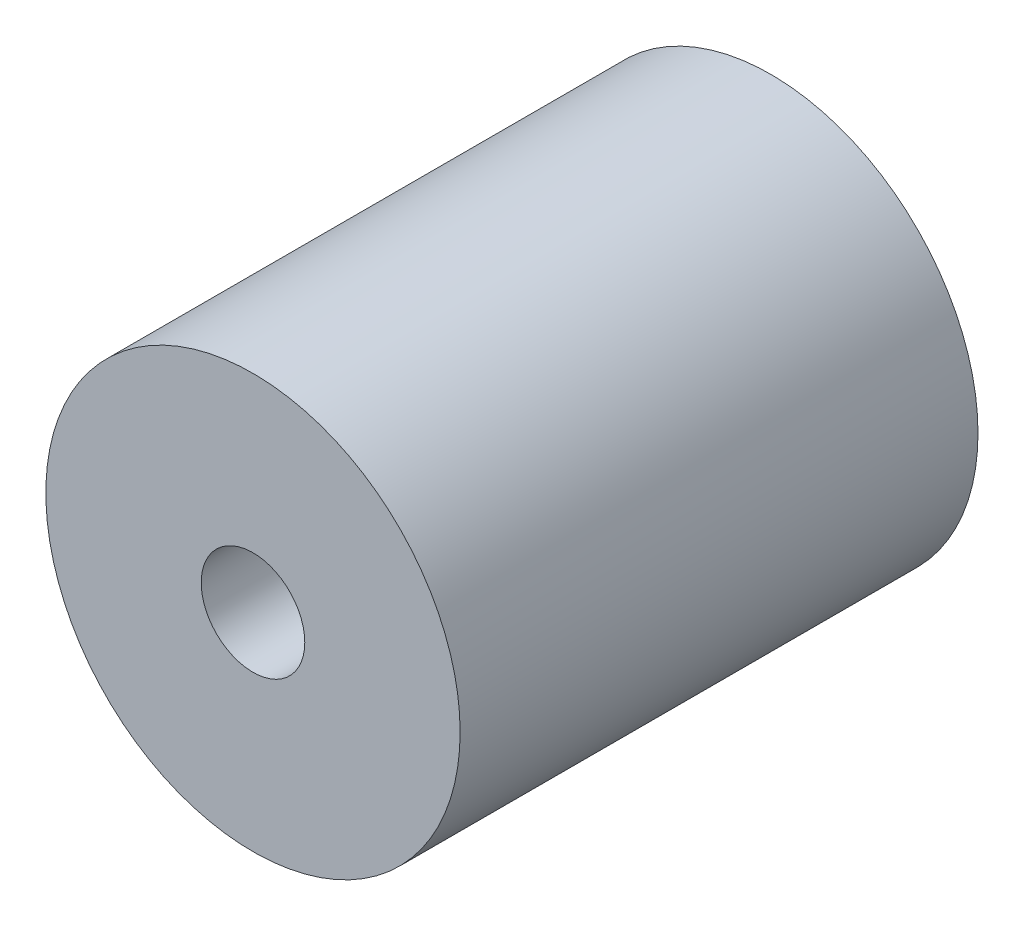
ISO-10303-21;
HEADER;
FILE_DESCRIPTION(('STEP AP214'),'2;1');
FILE_NAME('part.step','',(''),(''),'','','');
FILE_SCHEMA(('AUTOMOTIVE_DESIGN { 1 0 10303 214 1 1 1 1 }'));
ENDSEC;
DATA;
#1=APPLICATION_CONTEXT('core data for automotive mechanical design processes');
#2=APPLICATION_PROTOCOL_DEFINITION('international standard','automotive_design',2000,#1);
#3=PRODUCT_CONTEXT('',#1,'mechanical');
#4=PRODUCT('Part','Part','',(#3));
#5=PRODUCT_RELATED_PRODUCT_CATEGORY('part','',(#4));
#6=PRODUCT_DEFINITION_FORMATION('','',#4);
#7=PRODUCT_DEFINITION_CONTEXT('part definition',#1,'design');
#8=PRODUCT_DEFINITION('design','',#6,#7);
#9=PRODUCT_DEFINITION_SHAPE('','',#8);
#10=(LENGTH_UNIT() NAMED_UNIT(*) SI_UNIT(.MILLI.,.METRE.));
#11=(NAMED_UNIT(*) PLANE_ANGLE_UNIT() SI_UNIT($,.RADIAN.));
#12=(NAMED_UNIT(*) SI_UNIT($,.STERADIAN.) SOLID_ANGLE_UNIT());
#13=UNCERTAINTY_MEASURE_WITH_UNIT(LENGTH_MEASURE(1.E-05),#10,'distance_accuracy_value','');
#14=(GEOMETRIC_REPRESENTATION_CONTEXT(3) GLOBAL_UNCERTAINTY_ASSIGNED_CONTEXT((#13)) GLOBAL_UNIT_ASSIGNED_CONTEXT((#10,
#11,#12)) REPRESENTATION_CONTEXT('',''));
#15=CARTESIAN_POINT('',(0.,0.,0.));
#16=DIRECTION('',(0.,0.,1.));
#17=DIRECTION('',(1.,0.,0.));
#18=AXIS2_PLACEMENT_3D('',#15,#16,#17);
#19=CARTESIAN_POINT('',(0.,0.,25.));
#20=DIRECTION('',(0.,0.,-1.));
#21=DIRECTION('',(-1.,0.,0.));
#22=AXIS2_PLACEMENT_3D('',#19,#20,#21);
#23=CYLINDRICAL_SURFACE('',#22,10.);
#24=CARTESIAN_POINT('',(0.,0.,25.));
#25=DIRECTION('',(0.,0.,1.));
#26=DIRECTION('',(1.,0.,0.));
#27=AXIS2_PLACEMENT_3D('',#24,#25,#26);
#28=CIRCLE('',#27,10.);
#29=CARTESIAN_POINT('',(10.,0.,25.));
#30=VERTEX_POINT('',#29);
#31=EDGE_CURVE('E10',#30,#30,#28,.T.);
#32=ORIENTED_EDGE('',*,*,#31,.F.);
#33=EDGE_LOOP('',(#32));
#34=FACE_BOUND('',#33,.T.);
#35=CARTESIAN_POINT('',(0.,0.,0.));
#36=DIRECTION('',(0.,0.,1.));
#37=DIRECTION('',(1.,0.,0.));
#38=AXIS2_PLACEMENT_3D('',#35,#36,#37);
#39=CIRCLE('',#38,10.);
#40=CARTESIAN_POINT('',(10.,0.,0.));
#41=VERTEX_POINT('',#40);
#42=EDGE_CURVE('E37',#41,#41,#39,.T.);
#43=ORIENTED_EDGE('',*,*,#42,.T.);
#44=EDGE_LOOP('',(#43));
#45=FACE_BOUND('',#44,.T.);
#46=ADVANCED_FACE('F34',(#34,#45),#23,.T.);
#47=CARTESIAN_POINT('',(0.,0.,25.));
#48=DIRECTION('',(0.,0.,1.));
#49=DIRECTION('',(1.,0.,0.));
#50=AXIS2_PLACEMENT_3D('',#47,#48,#49);
#51=PLANE('',#50);
#52=CARTESIAN_POINT('',(0.,0.,25.));
#53=DIRECTION('',(0.,0.,1.));
#54=DIRECTION('',(1.,0.,0.));
#55=AXIS2_PLACEMENT_3D('',#52,#53,#54);
#56=CIRCLE('',#55,2.5);
#57=CARTESIAN_POINT('',(2.5,0.,25.));
#58=VERTEX_POINT('',#57);
#59=EDGE_CURVE('E46',#58,#58,#56,.T.);
#60=ORIENTED_EDGE('',*,*,#59,.F.);
#61=EDGE_LOOP('',(#60));
#62=FACE_BOUND('',#61,.T.);
#63=ORIENTED_EDGE('',*,*,#31,.T.);
#64=EDGE_LOOP('',(#63));
#65=FACE_BOUND('',#64,.T.);
#66=ADVANCED_FACE('F71',(#62,#65),#51,.T.);
#67=CARTESIAN_POINT('',(0.,0.,0.));
#68=DIRECTION('',(0.,0.,1.));
#69=DIRECTION('',(1.,0.,0.));
#70=AXIS2_PLACEMENT_3D('',#67,#68,#69);
#71=PLANE('',#70);
#72=CARTESIAN_POINT('',(0.,0.,0.));
#73=DIRECTION('',(0.,0.,-1.));
#74=DIRECTION('',(-1.,0.,0.));
#75=AXIS2_PLACEMENT_3D('',#72,#73,#74);
#76=CIRCLE('',#75,3.175);
#77=CARTESIAN_POINT('',(-3.175,0.,0.));
#78=VERTEX_POINT('',#77);
#79=EDGE_CURVE('E52',#78,#78,#76,.T.);
#80=ORIENTED_EDGE('',*,*,#79,.F.);
#81=EDGE_LOOP('',(#80));
#82=FACE_BOUND('',#81,.T.);
#83=ORIENTED_EDGE('',*,*,#42,.F.);
#84=EDGE_LOOP('',(#83));
#85=FACE_BOUND('',#84,.T.);
#86=ADVANCED_FACE('F67',(#82,#85),#71,.F.);
#87=CARTESIAN_POINT('',(0.,0.,19.));
#88=DIRECTION('',(0.,0.,1.));
#89=DIRECTION('',(1.,0.,0.));
#90=AXIS2_PLACEMENT_3D('',#87,#88,#89);
#91=CYLINDRICAL_SURFACE('',#90,2.5);
#92=CARTESIAN_POINT('',(0.,0.,19.));
#93=DIRECTION('',(0.,0.,1.));
#94=DIRECTION('',(1.,0.,0.));
#95=AXIS2_PLACEMENT_3D('',#92,#93,#94);
#96=CIRCLE('',#95,2.5);
#97=CARTESIAN_POINT('',(2.5,0.,19.));
#98=VERTEX_POINT('',#97);
#99=EDGE_CURVE('E44',#98,#98,#96,.T.);
#100=ORIENTED_EDGE('',*,*,#99,.F.);
#101=EDGE_LOOP('',(#100));
#102=FACE_BOUND('',#101,.T.);
#103=ORIENTED_EDGE('',*,*,#59,.T.);
#104=EDGE_LOOP('',(#103));
#105=FACE_BOUND('',#104,.T.);
#106=ADVANCED_FACE('F70',(#102,#105),#91,.F.);
#107=CARTESIAN_POINT('',(0.,0.,19.));
#108=DIRECTION('',(0.,0.,1.));
#109=DIRECTION('',(1.,0.,0.));
#110=AXIS2_PLACEMENT_3D('',#107,#108,#109);
#111=PLANE('',#110);
#112=ORIENTED_EDGE('',*,*,#99,.T.);
#113=EDGE_LOOP('',(#112));
#114=FACE_BOUND('',#113,.T.);
#115=ADVANCED_FACE('F63',(#114),#111,.T.);
#116=CARTESIAN_POINT('',(0.,0.,6.));
#117=DIRECTION('',(0.,0.,-1.));
#118=DIRECTION('',(-1.,0.,0.));
#119=AXIS2_PLACEMENT_3D('',#116,#117,#118);
#120=CYLINDRICAL_SURFACE('',#119,3.175);
#121=CARTESIAN_POINT('',(0.,0.,6.));
#122=DIRECTION('',(0.,0.,-1.));
#123=DIRECTION('',(-1.,0.,0.));
#124=AXIS2_PLACEMENT_3D('',#121,#122,#123);
#125=CIRCLE('',#124,3.175);
#126=CARTESIAN_POINT('',(-3.175,0.,6.));
#127=VERTEX_POINT('',#126);
#128=EDGE_CURVE('E49',#127,#127,#125,.T.);
#129=ORIENTED_EDGE('',*,*,#128,.F.);
#130=EDGE_LOOP('',(#129));
#131=FACE_BOUND('',#130,.T.);
#132=ORIENTED_EDGE('',*,*,#79,.T.);
#133=EDGE_LOOP('',(#132));
#134=FACE_BOUND('',#133,.T.);
#135=ADVANCED_FACE('F60',(#131,#134),#120,.F.);
#136=CARTESIAN_POINT('',(0.,0.,6.));
#137=DIRECTION('',(0.,0.,-1.));
#138=DIRECTION('',(-1.,0.,0.));
#139=AXIS2_PLACEMENT_3D('',#136,#137,#138);
#140=PLANE('',#139);
#141=ORIENTED_EDGE('',*,*,#128,.T.);
#142=EDGE_LOOP('',(#141));
#143=FACE_BOUND('',#142,.T.);
#144=ADVANCED_FACE('F58',(#143),#140,.T.);
#145=CLOSED_SHELL('',(#46,#66,#86,#106,#115,#135,#144));
#146=MANIFOLD_SOLID_BREP('B2',#145);
#147=ADVANCED_BREP_SHAPE_REPRESENTATION('',(#18,#146),#14);
#148=SHAPE_DEFINITION_REPRESENTATION(#9,#147);
ENDSEC;
END-ISO-10303-21;
